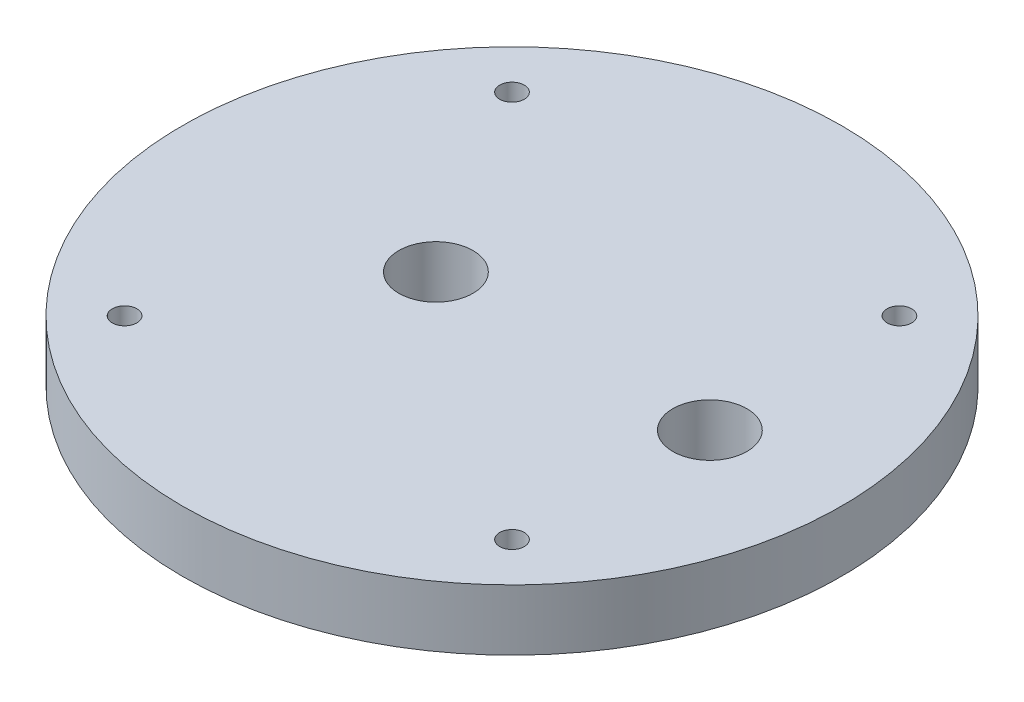
ISO-10303-21;
HEADER;
FILE_DESCRIPTION(('STEP AP214'),'2;1');
FILE_NAME('part.step','',(''),(''),'','','');
FILE_SCHEMA(('AUTOMOTIVE_DESIGN { 1 0 10303 214 1 1 1 1 }'));
ENDSEC;
DATA;
#1=APPLICATION_CONTEXT('core data for automotive mechanical design processes');
#2=APPLICATION_PROTOCOL_DEFINITION('international standard','automotive_design',2000,#1);
#3=PRODUCT_CONTEXT('',#1,'mechanical');
#4=PRODUCT('Part','Part','',(#3));
#5=PRODUCT_RELATED_PRODUCT_CATEGORY('part','',(#4));
#6=PRODUCT_DEFINITION_FORMATION('','',#4);
#7=PRODUCT_DEFINITION_CONTEXT('part definition',#1,'design');
#8=PRODUCT_DEFINITION('design','',#6,#7);
#9=PRODUCT_DEFINITION_SHAPE('','',#8);
#10=(LENGTH_UNIT() NAMED_UNIT(*) SI_UNIT(.MILLI.,.METRE.));
#11=(NAMED_UNIT(*) PLANE_ANGLE_UNIT() SI_UNIT($,.RADIAN.));
#12=(NAMED_UNIT(*) SI_UNIT($,.STERADIAN.) SOLID_ANGLE_UNIT());
#13=UNCERTAINTY_MEASURE_WITH_UNIT(LENGTH_MEASURE(1.E-05),#10,'distance_accuracy_value','');
#14=(GEOMETRIC_REPRESENTATION_CONTEXT(3) GLOBAL_UNCERTAINTY_ASSIGNED_CONTEXT((#13)) GLOBAL_UNIT_ASSIGNED_CONTEXT((#10,
#11,#12)) REPRESENTATION_CONTEXT('',''));
#15=CARTESIAN_POINT('',(0.,0.,0.));
#16=DIRECTION('',(0.,0.,1.));
#17=DIRECTION('',(1.,0.,0.));
#18=AXIS2_PLACEMENT_3D('',#15,#16,#17);
#19=CARTESIAN_POINT('',(0.,5.08,0.));
#20=DIRECTION('',(0.,-1.,0.));
#21=DIRECTION('',(0.,0.,-1.));
#22=AXIS2_PLACEMENT_3D('',#19,#20,#21);
#23=CYLINDRICAL_SURFACE('',#22,27.5);
#24=CARTESIAN_POINT('',(0.,5.08,0.));
#25=DIRECTION('',(0.,1.,0.));
#26=DIRECTION('',(0.,0.,1.));
#27=AXIS2_PLACEMENT_3D('',#24,#25,#26);
#28=CIRCLE('',#27,27.5);
#29=CARTESIAN_POINT('',(0.,5.08,27.5));
#30=VERTEX_POINT('',#29);
#31=EDGE_CURVE('E10',#30,#30,#28,.T.);
#32=ORIENTED_EDGE('',*,*,#31,.F.);
#33=EDGE_LOOP('',(#32));
#34=FACE_BOUND('',#33,.T.);
#35=CARTESIAN_POINT('',(0.,0.,0.));
#36=DIRECTION('',(0.,1.,0.));
#37=DIRECTION('',(0.,0.,1.));
#38=AXIS2_PLACEMENT_3D('',#35,#36,#37);
#39=CIRCLE('',#38,27.5);
#40=CARTESIAN_POINT('',(0.,0.,27.5));
#41=VERTEX_POINT('',#40);
#42=EDGE_CURVE('E34',#41,#41,#39,.T.);
#43=ORIENTED_EDGE('',*,*,#42,.T.);
#44=EDGE_LOOP('',(#43));
#45=FACE_BOUND('',#44,.T.);
#46=ADVANCED_FACE('F31',(#34,#45),#23,.T.);
#47=CARTESIAN_POINT('',(0.,5.08,0.));
#48=DIRECTION('',(0.,1.,0.));
#49=DIRECTION('',(0.,0.,1.));
#50=AXIS2_PLACEMENT_3D('',#47,#48,#49);
#51=PLANE('',#50);
#52=CARTESIAN_POINT('',(-6.35,5.08,0.));
#53=DIRECTION('',(0.,1.,0.));
#54=DIRECTION('',(0.,0.,1.));
#55=AXIS2_PLACEMENT_3D('',#52,#53,#54);
#56=CIRCLE('',#55,3.095);
#57=CARTESIAN_POINT('',(-6.35,5.08,3.095));
#58=VERTEX_POINT('',#57);
#59=EDGE_CURVE('E73',#58,#58,#56,.T.);
#60=ORIENTED_EDGE('',*,*,#59,.F.);
#61=EDGE_LOOP('',(#60));
#62=FACE_BOUND('',#61,.T.);
#63=CARTESIAN_POINT('',(16.51,5.08,0.));
#64=DIRECTION('',(0.,1.,0.));
#65=DIRECTION('',(0.,0.,1.));
#66=AXIS2_PLACEMENT_3D('',#63,#64,#65);
#67=CIRCLE('',#66,3.095);
#68=CARTESIAN_POINT('',(16.51,5.08,3.095));
#69=VERTEX_POINT('',#68);
#70=EDGE_CURVE('E67',#69,#69,#67,.T.);
#71=ORIENTED_EDGE('',*,*,#70,.F.);
#72=EDGE_LOOP('',(#71));
#73=FACE_BOUND('',#72,.T.);
#74=CARTESIAN_POINT('',(16.1644610179254,5.08,16.1644610179245));
#75=DIRECTION('',(0.,1.,0.));
#76=DIRECTION('',(0.,0.,1.));
#77=AXIS2_PLACEMENT_3D('',#74,#75,#76);
#78=CIRCLE('',#77,1.02499999999977);
#79=CARTESIAN_POINT('',(16.1644610179254,5.08,17.1894610179242));
#80=VERTEX_POINT('',#79);
#81=EDGE_CURVE('E56',#80,#80,#78,.T.);
#82=ORIENTED_EDGE('',*,*,#81,.F.);
#83=EDGE_LOOP('',(#82));
#84=FACE_BOUND('',#83,.T.);
#85=CARTESIAN_POINT('',(-16.1644610179245,5.08,-16.1644610179236));
#86=DIRECTION('',(0.,1.,0.));
#87=DIRECTION('',(0.,0.,1.));
#88=AXIS2_PLACEMENT_3D('',#85,#86,#87);
#89=CIRCLE('',#88,1.02500000000097);
#90=CARTESIAN_POINT('',(-16.1644610179245,5.08,-15.1394610179226));
#91=VERTEX_POINT('',#90);
#92=EDGE_CURVE('E49',#91,#91,#89,.T.);
#93=ORIENTED_EDGE('',*,*,#92,.F.);
#94=EDGE_LOOP('',(#93));
#95=FACE_BOUND('',#94,.T.);
#96=CARTESIAN_POINT('',(16.1644610179245,5.08,-16.1644610179245));
#97=DIRECTION('',(0.,1.,0.));
#98=DIRECTION('',(0.,0.,1.));
#99=AXIS2_PLACEMENT_3D('',#96,#97,#98);
#100=CIRCLE('',#99,1.025);
#101=CARTESIAN_POINT('',(16.1644610179245,5.08,-15.1394610179245));
#102=VERTEX_POINT('',#101);
#103=EDGE_CURVE('E61',#102,#102,#100,.T.);
#104=ORIENTED_EDGE('',*,*,#103,.F.);
#105=EDGE_LOOP('',(#104));
#106=FACE_BOUND('',#105,.T.);
#107=CARTESIAN_POINT('',(-16.1644610179236,5.08,16.1644610179254));
#108=DIRECTION('',(0.,1.,0.));
#109=DIRECTION('',(0.,0.,1.));
#110=AXIS2_PLACEMENT_3D('',#107,#108,#109);
#111=CIRCLE('',#110,1.02500000000068);
#112=CARTESIAN_POINT('',(-16.1644610179236,5.08,17.1894610179261));
#113=VERTEX_POINT('',#112);
#114=EDGE_CURVE('E43',#113,#113,#111,.T.);
#115=ORIENTED_EDGE('',*,*,#114,.F.);
#116=EDGE_LOOP('',(#115));
#117=FACE_BOUND('',#116,.T.);
#118=ORIENTED_EDGE('',*,*,#31,.T.);
#119=EDGE_LOOP('',(#118));
#120=FACE_BOUND('',#119,.T.);
#121=ADVANCED_FACE('F89',(#62,#73,#84,#95,#106,#117,#120),#51,.T.);
#122=CARTESIAN_POINT('',(0.,0.,0.));
#123=DIRECTION('',(0.,1.,0.));
#124=DIRECTION('',(0.,0.,1.));
#125=AXIS2_PLACEMENT_3D('',#122,#123,#124);
#126=PLANE('',#125);
#127=CARTESIAN_POINT('',(-6.35,0.,0.));
#128=DIRECTION('',(0.,1.,0.));
#129=DIRECTION('',(0.,0.,1.));
#130=AXIS2_PLACEMENT_3D('',#127,#128,#129);
#131=CIRCLE('',#130,3.095);
#132=CARTESIAN_POINT('',(-6.35,0.,3.095));
#133=VERTEX_POINT('',#132);
#134=EDGE_CURVE('E64',#133,#133,#131,.T.);
#135=ORIENTED_EDGE('',*,*,#134,.T.);
#136=EDGE_LOOP('',(#135));
#137=FACE_BOUND('',#136,.T.);
#138=CARTESIAN_POINT('',(16.51,0.,0.));
#139=DIRECTION('',(0.,1.,0.));
#140=DIRECTION('',(0.,0.,1.));
#141=AXIS2_PLACEMENT_3D('',#138,#139,#140);
#142=CIRCLE('',#141,3.095);
#143=CARTESIAN_POINT('',(16.51,0.,3.095));
#144=VERTEX_POINT('',#143);
#145=EDGE_CURVE('E70',#144,#144,#142,.T.);
#146=ORIENTED_EDGE('',*,*,#145,.T.);
#147=EDGE_LOOP('',(#146));
#148=FACE_BOUND('',#147,.T.);
#149=ORIENTED_EDGE('',*,*,#42,.F.);
#150=EDGE_LOOP('',(#149));
#151=FACE_BOUND('',#150,.T.);
#152=ADVANCED_FACE('F79',(#137,#148,#151),#126,.F.);
#153=CARTESIAN_POINT('',(-16.1644610179236,1.905,16.1644610179254));
#154=DIRECTION('',(0.,1.,0.));
#155=DIRECTION('',(0.,0.,1.));
#156=AXIS2_PLACEMENT_3D('',#153,#154,#155);
#157=CYLINDRICAL_SURFACE('',#156,1.02500000000068);
#158=CARTESIAN_POINT('',(-16.1644610179236,1.905,16.1644610179254));
#159=DIRECTION('',(0.,1.,0.));
#160=DIRECTION('',(0.,0.,1.));
#161=AXIS2_PLACEMENT_3D('',#158,#159,#160);
#162=CIRCLE('',#161,1.02500000000068);
#163=CARTESIAN_POINT('',(-16.1644610179236,1.905,17.1894610179261));
#164=VERTEX_POINT('',#163);
#165=EDGE_CURVE('E41',#164,#164,#162,.T.);
#166=ORIENTED_EDGE('',*,*,#165,.F.);
#167=EDGE_LOOP('',(#166));
#168=FACE_BOUND('',#167,.T.);
#169=ORIENTED_EDGE('',*,*,#114,.T.);
#170=EDGE_LOOP('',(#169));
#171=FACE_BOUND('',#170,.T.);
#172=ADVANCED_FACE('F103',(#168,#171),#157,.F.);
#173=CARTESIAN_POINT('',(0.,1.905,0.));
#174=DIRECTION('',(0.,1.,0.));
#175=DIRECTION('',(0.,0.,1.));
#176=AXIS2_PLACEMENT_3D('',#173,#174,#175);
#177=PLANE('',#176);
#178=ORIENTED_EDGE('',*,*,#165,.T.);
#179=EDGE_LOOP('',(#178));
#180=FACE_BOUND('',#179,.T.);
#181=ADVANCED_FACE('F105',(#180),#177,.T.);
#182=CARTESIAN_POINT('',(16.1644610179245,1.905,-16.1644610179245));
#183=DIRECTION('',(0.,1.,0.));
#184=DIRECTION('',(0.,0.,1.));
#185=AXIS2_PLACEMENT_3D('',#182,#183,#184);
#186=CYLINDRICAL_SURFACE('',#185,1.025);
#187=CARTESIAN_POINT('',(16.1644610179245,1.905,-16.1644610179245));
#188=DIRECTION('',(0.,1.,0.));
#189=DIRECTION('',(0.,0.,1.));
#190=AXIS2_PLACEMENT_3D('',#187,#188,#189);
#191=CIRCLE('',#190,1.025);
#192=CARTESIAN_POINT('',(16.1644610179245,1.905,-15.1394610179245));
#193=VERTEX_POINT('',#192);
#194=EDGE_CURVE('E53',#193,#193,#191,.T.);
#195=ORIENTED_EDGE('',*,*,#194,.F.);
#196=EDGE_LOOP('',(#195));
#197=FACE_BOUND('',#196,.T.);
#198=ORIENTED_EDGE('',*,*,#103,.T.);
#199=EDGE_LOOP('',(#198));
#200=FACE_BOUND('',#199,.T.);
#201=ADVANCED_FACE('F112',(#197,#200),#186,.F.);
#202=CARTESIAN_POINT('',(0.,1.905,0.));
#203=DIRECTION('',(0.,1.,0.));
#204=DIRECTION('',(0.,0.,1.));
#205=AXIS2_PLACEMENT_3D('',#202,#203,#204);
#206=PLANE('',#205);
#207=ORIENTED_EDGE('',*,*,#194,.T.);
#208=EDGE_LOOP('',(#207));
#209=FACE_BOUND('',#208,.T.);
#210=ADVANCED_FACE('F182',(#209),#206,.T.);
#211=CARTESIAN_POINT('',(-16.1644610179245,1.905,-16.1644610179236));
#212=DIRECTION('',(0.,1.,0.));
#213=DIRECTION('',(0.,0.,1.));
#214=AXIS2_PLACEMENT_3D('',#211,#212,#213);
#215=CYLINDRICAL_SURFACE('',#214,1.02500000000097);
#216=CARTESIAN_POINT('',(-16.1644610179245,1.905,-16.1644610179236));
#217=DIRECTION('',(0.,1.,0.));
#218=DIRECTION('',(0.,0.,1.));
#219=AXIS2_PLACEMENT_3D('',#216,#217,#218);
#220=CIRCLE('',#219,1.02500000000097);
#221=CARTESIAN_POINT('',(-16.1644610179245,1.905,-15.1394610179226));
#222=VERTEX_POINT('',#221);
#223=EDGE_CURVE('E52',#222,#222,#220,.T.);
#224=ORIENTED_EDGE('',*,*,#223,.F.);
#225=EDGE_LOOP('',(#224));
#226=FACE_BOUND('',#225,.T.);
#227=ORIENTED_EDGE('',*,*,#92,.T.);
#228=EDGE_LOOP('',(#227));
#229=FACE_BOUND('',#228,.T.);
#230=ADVANCED_FACE('F174',(#226,#229),#215,.F.);
#231=CARTESIAN_POINT('',(0.,1.905,0.));
#232=DIRECTION('',(0.,1.,0.));
#233=DIRECTION('',(0.,0.,1.));
#234=AXIS2_PLACEMENT_3D('',#231,#232,#233);
#235=PLANE('',#234);
#236=ORIENTED_EDGE('',*,*,#223,.T.);
#237=EDGE_LOOP('',(#236));
#238=FACE_BOUND('',#237,.T.);
#239=ADVANCED_FACE('F166',(#238),#235,.T.);
#240=CARTESIAN_POINT('',(16.1644610179254,1.905,16.1644610179245));
#241=DIRECTION('',(0.,1.,0.));
#242=DIRECTION('',(0.,0.,1.));
#243=AXIS2_PLACEMENT_3D('',#240,#241,#242);
#244=CYLINDRICAL_SURFACE('',#243,1.02499999999977);
#245=CARTESIAN_POINT('',(16.1644610179254,1.905,16.1644610179245));
#246=DIRECTION('',(0.,1.,0.));
#247=DIRECTION('',(0.,0.,1.));
#248=AXIS2_PLACEMENT_3D('',#245,#246,#247);
#249=CIRCLE('',#248,1.02499999999977);
#250=CARTESIAN_POINT('',(16.1644610179254,1.905,17.1894610179242));
#251=VERTEX_POINT('',#250);
#252=EDGE_CURVE('E46',#251,#251,#249,.T.);
#253=ORIENTED_EDGE('',*,*,#252,.F.);
#254=EDGE_LOOP('',(#253));
#255=FACE_BOUND('',#254,.T.);
#256=ORIENTED_EDGE('',*,*,#81,.T.);
#257=EDGE_LOOP('',(#256));
#258=FACE_BOUND('',#257,.T.);
#259=ADVANCED_FACE('F159',(#255,#258),#244,.F.);
#260=CARTESIAN_POINT('',(0.,1.905,0.));
#261=DIRECTION('',(0.,1.,0.));
#262=DIRECTION('',(0.,0.,1.));
#263=AXIS2_PLACEMENT_3D('',#260,#261,#262);
#264=PLANE('',#263);
#265=ORIENTED_EDGE('',*,*,#252,.T.);
#266=EDGE_LOOP('',(#265));
#267=FACE_BOUND('',#266,.T.);
#268=ADVANCED_FACE('F144',(#267),#264,.T.);
#269=CARTESIAN_POINT('',(16.51,0.,0.));
#270=DIRECTION('',(0.,1.,0.));
#271=DIRECTION('',(0.,0.,1.));
#272=AXIS2_PLACEMENT_3D('',#269,#270,#271);
#273=CYLINDRICAL_SURFACE('',#272,3.095);
#274=ORIENTED_EDGE('',*,*,#145,.F.);
#275=EDGE_LOOP('',(#274));
#276=FACE_BOUND('',#275,.T.);
#277=ORIENTED_EDGE('',*,*,#70,.T.);
#278=EDGE_LOOP('',(#277));
#279=FACE_BOUND('',#278,.T.);
#280=ADVANCED_FACE('F85',(#276,#279),#273,.F.);
#281=CARTESIAN_POINT('',(-6.35,0.,0.));
#282=DIRECTION('',(0.,1.,0.));
#283=DIRECTION('',(0.,0.,1.));
#284=AXIS2_PLACEMENT_3D('',#281,#282,#283);
#285=CYLINDRICAL_SURFACE('',#284,3.095);
#286=ORIENTED_EDGE('',*,*,#134,.F.);
#287=EDGE_LOOP('',(#286));
#288=FACE_BOUND('',#287,.T.);
#289=ORIENTED_EDGE('',*,*,#59,.T.);
#290=EDGE_LOOP('',(#289));
#291=FACE_BOUND('',#290,.T.);
#292=ADVANCED_FACE('F82',(#288,#291),#285,.F.);
#293=CLOSED_SHELL('',(#46,#121,#152,#172,#181,#201,#210,#230,#239,#259,#268,#280,#292));
#294=MANIFOLD_SOLID_BREP('B2',#293);
#295=ADVANCED_BREP_SHAPE_REPRESENTATION('',(#18,#294),#14);
#296=SHAPE_DEFINITION_REPRESENTATION(#9,#295);
ENDSEC;
END-ISO-10303-21;
